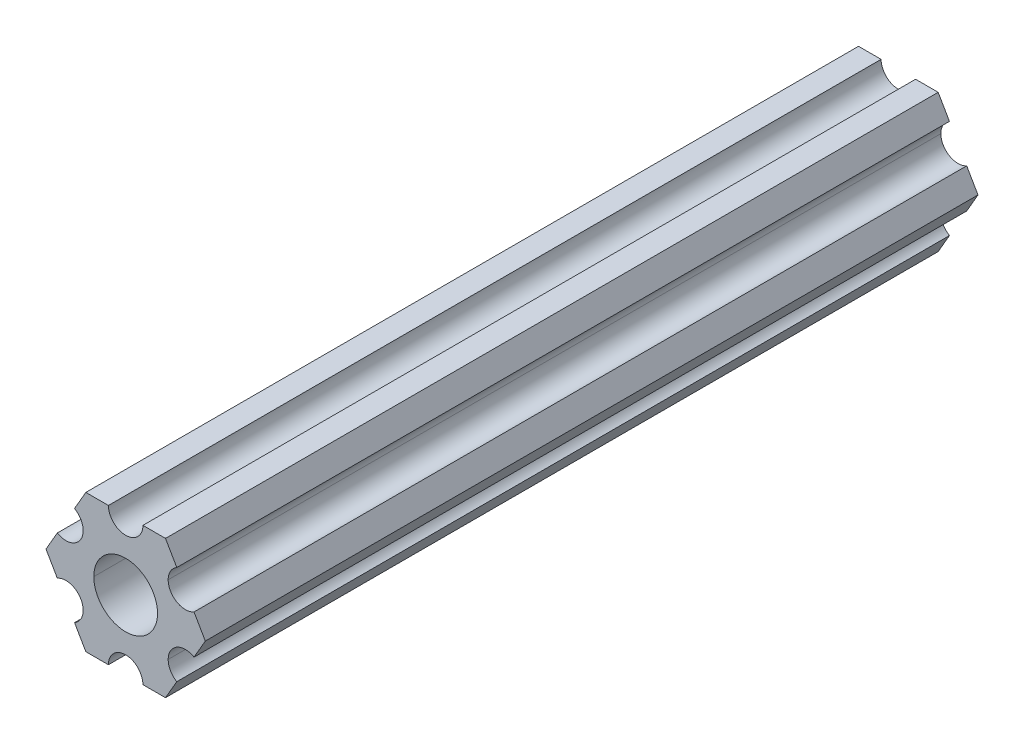
ISO-10303-21;
HEADER;
FILE_DESCRIPTION(('STEP AP214'),'2;1');
FILE_NAME('part.step','',(''),(''),'','','');
FILE_SCHEMA(('AUTOMOTIVE_DESIGN { 1 0 10303 214 1 1 1 1 }'));
ENDSEC;
DATA;
#1=APPLICATION_CONTEXT('core data for automotive mechanical design processes');
#2=APPLICATION_PROTOCOL_DEFINITION('international standard','automotive_design',2000,#1);
#3=PRODUCT_CONTEXT('',#1,'mechanical');
#4=PRODUCT('Part','Part','',(#3));
#5=PRODUCT_RELATED_PRODUCT_CATEGORY('part','',(#4));
#6=PRODUCT_DEFINITION_FORMATION('','',#4);
#7=PRODUCT_DEFINITION_CONTEXT('part definition',#1,'design');
#8=PRODUCT_DEFINITION('design','',#6,#7);
#9=PRODUCT_DEFINITION_SHAPE('','',#8);
#10=(LENGTH_UNIT() NAMED_UNIT(*) SI_UNIT(.MILLI.,.METRE.));
#11=(NAMED_UNIT(*) PLANE_ANGLE_UNIT() SI_UNIT($,.RADIAN.));
#12=(NAMED_UNIT(*) SI_UNIT($,.STERADIAN.) SOLID_ANGLE_UNIT());
#13=UNCERTAINTY_MEASURE_WITH_UNIT(LENGTH_MEASURE(1.E-05),#10,'distance_accuracy_value','');
#14=(GEOMETRIC_REPRESENTATION_CONTEXT(3) GLOBAL_UNCERTAINTY_ASSIGNED_CONTEXT((#13)) GLOBAL_UNIT_ASSIGNED_CONTEXT((#10,
#11,#12)) REPRESENTATION_CONTEXT('',''));
#15=CARTESIAN_POINT('',(0.,0.,0.));
#16=DIRECTION('',(0.,0.,1.));
#17=DIRECTION('',(1.,0.,0.));
#18=AXIS2_PLACEMENT_3D('',#15,#16,#17);
#19=CARTESIAN_POINT('',(6.29301142309098,-1.80018429024546,85.725));
#20=DIRECTION('',(-0.866025434075723,0.499999947533953,0.));
#21=DIRECTION('',(0.,0.,1.));
#22=AXIS2_PLACEMENT_3D('',#19,#20,#21);
#23=PLANE('',#22);
#24=DIRECTION('',(0.499999947533953,0.866025434075723,0.));
#25=VECTOR('',#24,1.);
#26=CARTESIAN_POINT('',(6.29301142309098,-1.80018429024546,71.12));
#27=LINE('',#26,#25);
#28=CARTESIAN_POINT('',(6.29301142309098,-1.80018429024546,71.12));
#29=VERTEX_POINT('',#28);
#30=CARTESIAN_POINT('',(7.33234841870826,4.44212519415746E-07,71.12));
#31=VERTEX_POINT('',#30);
#32=EDGE_CURVE('E398',#29,#31,#27,.T.);
#33=ORIENTED_EDGE('',*,*,#32,.F.);
#34=DIRECTION('',(0.,0.,-1.));
#35=VECTOR('',#34,1.);
#36=CARTESIAN_POINT('',(6.29301142309098,-1.80018429024546,85.725));
#37=LINE('',#36,#35);
#38=CARTESIAN_POINT('',(6.29301142309098,-1.80018429024546,0.));
#39=VERTEX_POINT('',#38);
#40=EDGE_CURVE('E270',#29,#39,#37,.T.);
#41=ORIENTED_EDGE('',*,*,#40,.T.);
#42=DIRECTION('',(0.499999947533953,0.866025434075723,0.));
#43=VECTOR('',#42,1.);
#44=CARTESIAN_POINT('',(6.29301142309098,-1.80018429024546,0.));
#45=LINE('',#44,#43);
#46=CARTESIAN_POINT('',(7.33234841870826,4.44212518961143E-07,0.));
#47=VERTEX_POINT('',#46);
#48=EDGE_CURVE('E292',#39,#47,#45,.T.);
#49=ORIENTED_EDGE('',*,*,#48,.T.);
#50=DIRECTION('',(0.,0.,1.));
#51=VECTOR('',#50,1.);
#52=CARTESIAN_POINT('',(7.33234841870827,4.44212519169686E-07,85.725));
#53=LINE('',#52,#51);
#54=EDGE_CURVE('E65',#47,#31,#53,.T.);
#55=ORIENTED_EDGE('',*,*,#54,.T.);
#56=EDGE_LOOP('',(#33,#41,#49,#55));
#57=FACE_BOUND('',#56,.T.);
#58=ADVANCED_FACE('F57',(#57),#23,.F.);
#59=CARTESIAN_POINT('',(7.33234841870827,4.44212519169686E-07,85.725));
#60=DIRECTION('',(-0.866025373493145,-0.500000052466057,0.));
#61=DIRECTION('',(-0.500000052466057,0.866025373493145,0.));
#62=AXIS2_PLACEMENT_3D('',#59,#60,#61);
#63=PLANE('',#62);
#64=DIRECTION('',(-0.500000052466057,0.866025373493145,0.));
#65=VECTOR('',#64,1.);
#66=CARTESIAN_POINT('',(7.33234841870827,4.44212519169686E-07,71.12));
#67=LINE('',#66,#65);
#68=CARTESIAN_POINT('',(6.29301120497139,1.80018505273895,71.12));
#69=VERTEX_POINT('',#68);
#70=EDGE_CURVE('E406',#31,#69,#67,.T.);
#71=ORIENTED_EDGE('',*,*,#70,.F.);
#72=ORIENTED_EDGE('',*,*,#54,.F.);
#73=DIRECTION('',(-0.500000052466057,0.866025373493145,0.));
#74=VECTOR('',#73,1.);
#75=CARTESIAN_POINT('',(7.33234841870827,4.44212519198906E-07,0.));
#76=LINE('',#75,#74);
#77=CARTESIAN_POINT('',(6.29301120497139,1.80018505273894,0.));
#78=VERTEX_POINT('',#77);
#79=EDGE_CURVE('E288',#47,#78,#76,.T.);
#80=ORIENTED_EDGE('',*,*,#79,.T.);
#81=DIRECTION('',(0.,0.,1.));
#82=VECTOR('',#81,1.);
#83=CARTESIAN_POINT('',(6.29301120497139,1.80018505273894,85.725));
#84=LINE('',#83,#82);
#85=EDGE_CURVE('E390',#78,#69,#84,.T.);
#86=ORIENTED_EDGE('',*,*,#85,.T.);
#87=EDGE_LOOP('',(#71,#72,#80,#86));
#88=FACE_BOUND('',#87,.T.);
#89=ADVANCED_FACE('F404',(#88),#63,.F.);
#90=CARTESIAN_POINT('',(5.49926112168156,3.17500033315934,85.725));
#91=DIRECTION('',(0.,0.,-1.));
#92=DIRECTION('',(-1.,0.,0.));
#93=AXIS2_PLACEMENT_3D('',#90,#91,#92);
#94=CYLINDRICAL_SURFACE('',#93,1.5875);
#95=CARTESIAN_POINT('',(5.49926112168156,3.17500033315934,71.12));
#96=DIRECTION('',(0.,0.,1.));
#97=DIRECTION('',(1.,0.,0.));
#98=AXIS2_PLACEMENT_3D('',#95,#96,#97);
#99=CIRCLE('',#98,1.5875);
#100=CARTESIAN_POINT('',(3.91176112168156,3.17500033315934,71.12));
#101=VERTEX_POINT('',#100);
#102=EDGE_CURVE('E409',#69,#101,#99,.F.);
#103=ORIENTED_EDGE('',*,*,#102,.F.);
#104=ORIENTED_EDGE('',*,*,#85,.F.);
#105=CARTESIAN_POINT('',(5.49926112168156,3.17500033315934,0.));
#106=DIRECTION('',(0.,0.,-1.));
#107=DIRECTION('',(-1.,0.,0.));
#108=AXIS2_PLACEMENT_3D('',#105,#106,#107);
#109=CIRCLE('',#108,1.5875);
#110=CARTESIAN_POINT('',(3.91176112168156,3.17500033315934,0.));
#111=VERTEX_POINT('',#110);
#112=EDGE_CURVE('E262',#78,#111,#109,.T.);
#113=ORIENTED_EDGE('',*,*,#112,.T.);
#114=DIRECTION('',(0.,0.,-1.));
#115=VECTOR('',#114,1.);
#116=CARTESIAN_POINT('',(3.91176112168156,3.17500033315934,85.725));
#117=LINE('',#116,#115);
#118=EDGE_CURVE('E273',#101,#111,#117,.T.);
#119=ORIENTED_EDGE('',*,*,#118,.F.);
#120=EDGE_LOOP('',(#103,#104,#113,#119));
#121=FACE_BOUND('',#120,.T.);
#122=ADVANCED_FACE('F869',(#121),#94,.F.);
#123=CARTESIAN_POINT('',(4.70551103839172,4.54981561357972,85.725));
#124=DIRECTION('',(-0.866025373493151,-0.500000052466046,0.));
#125=DIRECTION('',(-0.500000052466046,0.866025373493151,0.));
#126=AXIS2_PLACEMENT_3D('',#123,#124,#125);
#127=PLANE('',#126);
#128=DIRECTION('',(-0.500000052466046,0.866025373493151,0.));
#129=VECTOR('',#128,1.);
#130=CARTESIAN_POINT('',(4.70551103839172,4.54981561357972,71.12));
#131=LINE('',#130,#129);
#132=CARTESIAN_POINT('',(4.70551103839172,4.54981561357972,71.12));
#133=VERTEX_POINT('',#132);
#134=CARTESIAN_POINT('',(3.66617382465481,6.35000022210627,71.12));
#135=VERTEX_POINT('',#134);
#136=EDGE_CURVE('E479',#133,#135,#131,.T.);
#137=ORIENTED_EDGE('',*,*,#136,.F.);
#138=DIRECTION('',(0.,0.,1.));
#139=VECTOR('',#138,1.);
#140=CARTESIAN_POINT('',(4.70551103839172,4.54981561357972,85.725));
#141=LINE('',#140,#139);
#142=CARTESIAN_POINT('',(4.70551103839172,4.54981561357972,0.));
#143=VERTEX_POINT('',#142);
#144=EDGE_CURVE('E281',#143,#133,#141,.T.);
#145=ORIENTED_EDGE('',*,*,#144,.F.);
#146=DIRECTION('',(-0.500000052466046,0.866025373493151,0.));
#147=VECTOR('',#146,1.);
#148=CARTESIAN_POINT('',(4.70551103839172,4.54981561357972,0.));
#149=LINE('',#148,#147);
#150=CARTESIAN_POINT('',(3.66617382465481,6.35000022210627,0.));
#151=VERTEX_POINT('',#150);
#152=EDGE_CURVE('E259',#143,#151,#149,.T.);
#153=ORIENTED_EDGE('',*,*,#152,.T.);
#154=DIRECTION('',(0.,0.,1.));
#155=VECTOR('',#154,1.);
#156=CARTESIAN_POINT('',(3.66617382465481,6.35000022210627,85.725));
#157=LINE('',#156,#155);
#158=EDGE_CURVE('E386',#151,#135,#157,.T.);
#159=ORIENTED_EDGE('',*,*,#158,.T.);
#160=EDGE_LOOP('',(#137,#145,#153,#159));
#161=FACE_BOUND('',#160,.T.);
#162=ADVANCED_FACE('F491',(#161),#127,.F.);
#163=CARTESIAN_POINT('',(3.66617382465481,6.35000022210627,85.725));
#164=DIRECTION('',(6.05825850611185E-08,-1.,0.));
#165=DIRECTION('',(0.,0.,-1.));
#166=AXIS2_PLACEMENT_3D('',#163,#164,#165);
#167=PLANE('',#166);
#168=DIRECTION('',(-0.999999999999998,-6.05825850611184E-08,0.));
#169=VECTOR('',#168,1.);
#170=CARTESIAN_POINT('',(3.66617382465481,6.35000022210627,71.12));
#171=LINE('',#170,#169);
#172=CARTESIAN_POINT('',(1.58749961530074,6.35,71.12));
#173=VERTEX_POINT('',#172);
#174=EDGE_CURVE('E476',#135,#173,#171,.T.);
#175=ORIENTED_EDGE('',*,*,#174,.F.);
#176=ORIENTED_EDGE('',*,*,#158,.F.);
#177=DIRECTION('',(-1.,0.,0.));
#178=VECTOR('',#177,1.);
#179=CARTESIAN_POINT('',(5.49926112168156,6.35000022210627,0.));
#180=LINE('',#179,#178);
#181=CARTESIAN_POINT('',(1.58749961530073,6.35000015914054,0.));
#182=VERTEX_POINT('',#181);
#183=EDGE_CURVE('E263',#151,#182,#180,.T.);
#184=ORIENTED_EDGE('',*,*,#183,.T.);
#185=DIRECTION('',(0.,0.,1.));
#186=VECTOR('',#185,1.);
#187=CARTESIAN_POINT('',(1.58749961530074,6.35000009617482,85.725));
#188=LINE('',#187,#186);
#189=EDGE_CURVE('E303',#182,#173,#188,.T.);
#190=ORIENTED_EDGE('',*,*,#189,.T.);
#191=EDGE_LOOP('',(#175,#176,#184,#190));
#192=FACE_BOUND('',#191,.T.);
#193=ADVANCED_FACE('F498',(#192),#167,.F.);
#194=CARTESIAN_POINT('',(-3.84699260060323E-07,6.35,85.725));
#195=DIRECTION('',(0.,0.,-1.));
#196=DIRECTION('',(-1.,0.,0.));
#197=AXIS2_PLACEMENT_3D('',#194,#195,#196);
#198=CYLINDRICAL_SURFACE('',#197,1.5875);
#199=CARTESIAN_POINT('',(-3.84699260060323E-07,6.35,71.12));
#200=DIRECTION('',(0.,0.,1.));
#201=DIRECTION('',(1.,0.,0.));
#202=AXIS2_PLACEMENT_3D('',#199,#200,#201);
#203=CIRCLE('',#202,1.5875);
#204=CARTESIAN_POINT('',(-1.58750038469926,6.34999990382518,71.12));
#205=VERTEX_POINT('',#204);
#206=EDGE_CURVE('E473',#173,#205,#203,.F.);
#207=ORIENTED_EDGE('',*,*,#206,.F.);
#208=ORIENTED_EDGE('',*,*,#189,.F.);
#209=CARTESIAN_POINT('',(-3.84699260060323E-07,6.35,0.));
#210=DIRECTION('',(0.,0.,-1.));
#211=DIRECTION('',(-1.,0.,0.));
#212=AXIS2_PLACEMENT_3D('',#209,#210,#211);
#213=CIRCLE('',#212,1.5875);
#214=CARTESIAN_POINT('',(-1.58750038469926,6.34999990382519,0.));
#215=VERTEX_POINT('',#214);
#216=EDGE_CURVE('E329',#182,#215,#213,.T.);
#217=ORIENTED_EDGE('',*,*,#216,.T.);
#218=DIRECTION('',(0.,0.,1.));
#219=VECTOR('',#218,1.);
#220=CARTESIAN_POINT('',(-1.58750038469926,6.34999990382518,85.725));
#221=LINE('',#220,#219);
#222=EDGE_CURVE('E299',#215,#205,#221,.T.);
#223=ORIENTED_EDGE('',*,*,#222,.T.);
#224=EDGE_LOOP('',(#207,#208,#217,#223));
#225=FACE_BOUND('',#224,.T.);
#226=ADVANCED_FACE('F502',(#225),#198,.F.);
#227=CARTESIAN_POINT('',(-1.58750038469926,6.34999990382518,85.725));
#228=DIRECTION('',(6.05825963273174E-08,-1.,0.));
#229=DIRECTION('',(0.,0.,-1.));
#230=AXIS2_PLACEMENT_3D('',#227,#228,#229);
#231=PLANE('',#230);
#232=DIRECTION('',(-0.999999999999998,-6.05825963273173E-08,0.));
#233=VECTOR('',#232,1.);
#234=CARTESIAN_POINT('',(-1.58750038469926,6.34999990382518,71.12));
#235=LINE('',#234,#233);
#236=CARTESIAN_POINT('',(-3.66617454558244,6.34999986184803,71.12));
#237=VERTEX_POINT('',#236);
#238=EDGE_CURVE('E470',#205,#237,#235,.T.);
#239=ORIENTED_EDGE('',*,*,#238,.F.);
#240=ORIENTED_EDGE('',*,*,#222,.F.);
#241=DIRECTION('',(-1.,0.,0.));
#242=VECTOR('',#241,1.);
#243=CARTESIAN_POINT('',(5.49926112168156,6.34999990382519,0.));
#244=LINE('',#243,#242);
#245=CARTESIAN_POINT('',(-3.66617454558244,6.34999986184803,0.));
#246=VERTEX_POINT('',#245);
#247=EDGE_CURVE('E333',#215,#246,#244,.T.);
#248=ORIENTED_EDGE('',*,*,#247,.T.);
#249=DIRECTION('',(0.,0.,1.));
#250=VECTOR('',#249,1.);
#251=CARTESIAN_POINT('',(-3.66617459405349,6.3499997778937,85.725));
#252=LINE('',#251,#250);
#253=EDGE_CURVE('E286',#246,#237,#252,.T.);
#254=ORIENTED_EDGE('',*,*,#253,.T.);
#255=EDGE_LOOP('',(#239,#240,#248,#254));
#256=FACE_BOUND('',#255,.T.);
#257=ADVANCED_FACE('F504',(#256),#231,.F.);
#258=CARTESIAN_POINT('',(-3.66617459405349,6.3499997778937,85.725));
#259=DIRECTION('',(0.866025434075729,-0.499999947533942,0.));
#260=DIRECTION('',(0.,0.,-1.));
#261=AXIS2_PLACEMENT_3D('',#258,#259,#260);
#262=PLANE('',#261);
#263=DIRECTION('',(-0.499999947533942,-0.866025434075729,0.));
#264=VECTOR('',#263,1.);
#265=CARTESIAN_POINT('',(-3.66617459405349,6.3499997778937,71.12));
#266=LINE('',#265,#264);
#267=CARTESIAN_POINT('',(-4.70551158967065,4.54981504343587,71.12));
#268=VERTEX_POINT('',#267);
#269=EDGE_CURVE('E467',#237,#268,#266,.T.);
#270=ORIENTED_EDGE('',*,*,#269,.F.);
#271=ORIENTED_EDGE('',*,*,#253,.F.);
#272=DIRECTION('',(-0.499999947533943,-0.866025434075729,0.));
#273=VECTOR('',#272,1.);
#274=CARTESIAN_POINT('',(-3.66617459405349,6.3499997778937,0.));
#275=LINE('',#274,#273);
#276=CARTESIAN_POINT('',(-4.70551158967065,4.54981504343587,0.));
#277=VERTEX_POINT('',#276);
#278=EDGE_CURVE('E345',#246,#277,#275,.T.);
#279=ORIENTED_EDGE('',*,*,#278,.T.);
#280=DIRECTION('',(0.,0.,1.));
#281=VECTOR('',#280,1.);
#282=CARTESIAN_POINT('',(-4.70551158967065,4.54981504343587,85.725));
#283=LINE('',#282,#281);
#284=EDGE_CURVE('E282',#277,#268,#283,.T.);
#285=ORIENTED_EDGE('',*,*,#284,.T.);
#286=EDGE_LOOP('',(#270,#271,#279,#285));
#287=FACE_BOUND('',#286,.T.);
#288=ADVANCED_FACE('F509',(#287),#262,.F.);
#289=CARTESIAN_POINT('',(-5.49926150638082,3.17499966684067,85.725));
#290=DIRECTION('',(0.,0.,-1.));
#291=DIRECTION('',(-1.,0.,0.));
#292=AXIS2_PLACEMENT_3D('',#289,#290,#291);
#293=CYLINDRICAL_SURFACE('',#292,1.5875);
#294=CARTESIAN_POINT('',(-5.49926150638082,3.17499966684067,71.12));
#295=DIRECTION('',(0.,0.,1.));
#296=DIRECTION('',(1.,0.,0.));
#297=AXIS2_PLACEMENT_3D('',#294,#295,#296);
#298=CIRCLE('',#297,1.5875);
#299=CARTESIAN_POINT('',(-6.29301142309098,1.80018429024547,71.12));
#300=VERTEX_POINT('',#299);
#301=EDGE_CURVE('E464',#268,#300,#298,.F.);
#302=ORIENTED_EDGE('',*,*,#301,.F.);
#303=ORIENTED_EDGE('',*,*,#284,.F.);
#304=CARTESIAN_POINT('',(-5.49926150638082,3.17499966684067,0.));
#305=DIRECTION('',(0.,0.,-1.));
#306=DIRECTION('',(-1.,0.,0.));
#307=AXIS2_PLACEMENT_3D('',#304,#305,#306);
#308=CIRCLE('',#307,1.5875);
#309=CARTESIAN_POINT('',(-6.29301142309098,1.80018429024547,0.));
#310=VERTEX_POINT('',#309);
#311=EDGE_CURVE('E341',#277,#310,#308,.T.);
#312=ORIENTED_EDGE('',*,*,#311,.T.);
#313=DIRECTION('',(0.,0.,1.));
#314=VECTOR('',#313,1.);
#315=CARTESIAN_POINT('',(-6.29301142309098,1.80018429024547,85.725));
#316=LINE('',#315,#314);
#317=EDGE_CURVE('E287',#310,#300,#316,.T.);
#318=ORIENTED_EDGE('',*,*,#317,.T.);
#319=EDGE_LOOP('',(#302,#303,#312,#318));
#320=FACE_BOUND('',#319,.T.);
#321=ADVANCED_FACE('F512',(#320),#293,.F.);
#322=CARTESIAN_POINT('',(-6.29301142309098,1.80018429024547,85.725));
#323=DIRECTION('',(0.866025434075724,-0.499999947533952,0.));
#324=DIRECTION('',(0.,0.,-1.));
#325=AXIS2_PLACEMENT_3D('',#322,#323,#324);
#326=PLANE('',#325);
#327=DIRECTION('',(-0.499999947533952,-0.866025434075724,0.));
#328=VECTOR('',#327,1.);
#329=CARTESIAN_POINT('',(-6.29301142309098,1.80018429024547,71.12));
#330=LINE('',#329,#328);
#331=CARTESIAN_POINT('',(-7.33234841870827,-4.44212524036369E-07,71.12));
#332=VERTEX_POINT('',#331);
#333=EDGE_CURVE('E461',#300,#332,#330,.T.);
#334=ORIENTED_EDGE('',*,*,#333,.F.);
#335=ORIENTED_EDGE('',*,*,#317,.F.);
#336=DIRECTION('',(-0.499999947533952,-0.866025434075724,0.));
#337=VECTOR('',#336,1.);
#338=CARTESIAN_POINT('',(-6.29301142309098,1.80018429024547,0.));
#339=LINE('',#338,#337);
#340=CARTESIAN_POINT('',(-7.33234841870826,-4.44212524036367E-07,0.));
#341=VERTEX_POINT('',#340);
#342=EDGE_CURVE('E337',#310,#341,#339,.T.);
#343=ORIENTED_EDGE('',*,*,#342,.T.);
#344=DIRECTION('',(0.,0.,1.));
#345=VECTOR('',#344,1.);
#346=CARTESIAN_POINT('',(-7.33234841870827,-4.44212523790841E-07,85.725));
#347=LINE('',#346,#345);
#348=EDGE_CURVE('E269',#341,#332,#347,.T.);
#349=ORIENTED_EDGE('',*,*,#348,.T.);
#350=EDGE_LOOP('',(#334,#335,#343,#349));
#351=FACE_BOUND('',#350,.T.);
#352=ADVANCED_FACE('F517',(#351),#326,.F.);
#353=CARTESIAN_POINT('',(-7.33234841870827,-4.44212523790841E-07,85.725));
#354=DIRECTION('',(0.866025373493151,0.500000052466045,0.));
#355=DIRECTION('',(0.,0.,-1.));
#356=AXIS2_PLACEMENT_3D('',#353,#354,#355);
#357=PLANE('',#356);
#358=DIRECTION('',(0.500000052466045,-0.866025373493151,0.));
#359=VECTOR('',#358,1.);
#360=CARTESIAN_POINT('',(-7.33234841870827,-4.44212523790841E-07,71.12));
#361=LINE('',#360,#359);
#362=CARTESIAN_POINT('',(-6.29301120497141,-1.80018505273896,71.12));
#363=VERTEX_POINT('',#362);
#364=EDGE_CURVE('E458',#332,#363,#361,.T.);
#365=ORIENTED_EDGE('',*,*,#364,.F.);
#366=ORIENTED_EDGE('',*,*,#348,.F.);
#367=DIRECTION('',(0.500000052466045,-0.866025373493151,0.));
#368=VECTOR('',#367,1.);
#369=CARTESIAN_POINT('',(-7.33234841870827,-4.44212523969395E-07,0.));
#370=LINE('',#369,#368);
#371=CARTESIAN_POINT('',(-6.29301120497141,-1.80018505273897,0.));
#372=VERTEX_POINT('',#371);
#373=EDGE_CURVE('E308',#341,#372,#370,.T.);
#374=ORIENTED_EDGE('',*,*,#373,.T.);
#375=DIRECTION('',(0.,0.,1.));
#376=VECTOR('',#375,1.);
#377=CARTESIAN_POINT('',(-6.29301120497141,-1.80018505273897,85.725));
#378=LINE('',#377,#376);
#379=EDGE_CURVE('E265',#372,#363,#378,.T.);
#380=ORIENTED_EDGE('',*,*,#379,.T.);
#381=EDGE_LOOP('',(#365,#366,#374,#380));
#382=FACE_BOUND('',#381,.T.);
#383=ADVANCED_FACE('F520',(#382),#357,.F.);
#384=CARTESIAN_POINT('',(-5.49926112168156,-3.17500033315934,85.725));
#385=DIRECTION('',(0.,0.,-1.));
#386=DIRECTION('',(-1.,0.,0.));
#387=AXIS2_PLACEMENT_3D('',#384,#385,#386);
#388=CYLINDRICAL_SURFACE('',#387,1.5875);
#389=CARTESIAN_POINT('',(-5.49926112168156,-3.17500033315934,71.12));
#390=DIRECTION('',(0.,0.,1.));
#391=DIRECTION('',(1.,0.,0.));
#392=AXIS2_PLACEMENT_3D('',#389,#390,#391);
#393=CIRCLE('',#392,1.5875);
#394=CARTESIAN_POINT('',(-4.70551103839172,-4.54981561357972,71.12));
#395=VERTEX_POINT('',#394);
#396=EDGE_CURVE('E455',#363,#395,#393,.F.);
#397=ORIENTED_EDGE('',*,*,#396,.F.);
#398=ORIENTED_EDGE('',*,*,#379,.F.);
#399=CARTESIAN_POINT('',(-5.49926112168156,-3.17500033315934,0.));
#400=DIRECTION('',(0.,0.,-1.));
#401=DIRECTION('',(-1.,0.,0.));
#402=AXIS2_PLACEMENT_3D('',#399,#400,#401);
#403=CIRCLE('',#402,1.5875);
#404=CARTESIAN_POINT('',(-4.70551103839172,-4.54981561357972,0.));
#405=VERTEX_POINT('',#404);
#406=EDGE_CURVE('E304',#372,#405,#403,.T.);
#407=ORIENTED_EDGE('',*,*,#406,.T.);
#408=DIRECTION('',(0.,0.,1.));
#409=VECTOR('',#408,1.);
#410=CARTESIAN_POINT('',(-4.70551103839172,-4.54981561357972,85.725));
#411=LINE('',#410,#409);
#412=EDGE_CURVE('E252',#405,#395,#411,.T.);
#413=ORIENTED_EDGE('',*,*,#412,.T.);
#414=EDGE_LOOP('',(#397,#398,#407,#413));
#415=FACE_BOUND('',#414,.T.);
#416=ADVANCED_FACE('F526',(#415),#388,.F.);
#417=CARTESIAN_POINT('',(-4.70551103839172,-4.54981561357972,85.725));
#418=DIRECTION('',(0.866025373493152,0.500000052466045,0.));
#419=DIRECTION('',(0.,0.,-1.));
#420=AXIS2_PLACEMENT_3D('',#417,#418,#419);
#421=PLANE('',#420);
#422=DIRECTION('',(0.500000052466045,-0.866025373493152,0.));
#423=VECTOR('',#422,1.);
#424=CARTESIAN_POINT('',(-4.70551103839172,-4.54981561357972,71.12));
#425=LINE('',#424,#423);
#426=CARTESIAN_POINT('',(-3.66617382465481,-6.35000022210628,71.12));
#427=VERTEX_POINT('',#426);
#428=EDGE_CURVE('E452',#395,#427,#425,.T.);
#429=ORIENTED_EDGE('',*,*,#428,.F.);
#430=ORIENTED_EDGE('',*,*,#412,.F.);
#431=DIRECTION('',(0.500000052466045,-0.866025373493151,0.));
#432=VECTOR('',#431,1.);
#433=CARTESIAN_POINT('',(-4.70551103839172,-4.54981561357972,0.));
#434=LINE('',#433,#432);
#435=CARTESIAN_POINT('',(-3.66617382465481,-6.35000022210628,0.));
#436=VERTEX_POINT('',#435);
#437=EDGE_CURVE('E309',#405,#436,#434,.T.);
#438=ORIENTED_EDGE('',*,*,#437,.T.);
#439=DIRECTION('',(0.,0.,1.));
#440=VECTOR('',#439,1.);
#441=CARTESIAN_POINT('',(-3.66617382465481,-6.35000022210628,85.725));
#442=LINE('',#441,#440);
#443=EDGE_CURVE('E370',#436,#427,#442,.T.);
#444=ORIENTED_EDGE('',*,*,#443,.T.);
#445=EDGE_LOOP('',(#429,#430,#438,#444));
#446=FACE_BOUND('',#445,.T.);
#447=ADVANCED_FACE('F807',(#446),#421,.F.);
#448=CARTESIAN_POINT('',(-3.66617382465481,-6.35000022210628,85.725));
#449=DIRECTION('',(-6.05825854783851E-08,1.,0.));
#450=DIRECTION('',(0.,0.,1.));
#451=AXIS2_PLACEMENT_3D('',#448,#449,#450);
#452=PLANE('',#451);
#453=DIRECTION('',(0.999999999999998,6.0582585478385E-08,0.));
#454=VECTOR('',#453,1.);
#455=CARTESIAN_POINT('',(-3.66617382465481,-6.35000022210628,71.12));
#456=LINE('',#455,#454);
#457=CARTESIAN_POINT('',(-1.58749961530073,-6.35000011105314,71.12));
#458=VERTEX_POINT('',#457);
#459=EDGE_CURVE('E449',#427,#458,#456,.T.);
#460=ORIENTED_EDGE('',*,*,#459,.F.);
#461=ORIENTED_EDGE('',*,*,#443,.F.);
#462=DIRECTION('',(1.,0.,0.));
#463=VECTOR('',#462,1.);
#464=CARTESIAN_POINT('',(5.49926112168156,-6.35000022210628,0.));
#465=LINE('',#464,#463);
#466=CARTESIAN_POINT('',(-1.58749961530073,-6.35000011105314,0.));
#467=VERTEX_POINT('',#466);
#468=EDGE_CURVE('E322',#436,#467,#465,.T.);
#469=ORIENTED_EDGE('',*,*,#468,.T.);
#470=DIRECTION('',(0.,0.,1.));
#471=VECTOR('',#470,1.);
#472=CARTESIAN_POINT('',(-1.58749961530074,-6.35,85.725));
#473=LINE('',#472,#471);
#474=EDGE_CURVE('E369',#467,#458,#473,.T.);
#475=ORIENTED_EDGE('',*,*,#474,.T.);
#476=EDGE_LOOP('',(#460,#461,#469,#475));
#477=FACE_BOUND('',#476,.T.);
#478=ADVANCED_FACE('F799',(#477),#452,.F.);
#479=CARTESIAN_POINT('',(3.8469926204343E-07,-6.35,85.725));
#480=DIRECTION('',(0.,0.,-1.));
#481=DIRECTION('',(-1.,0.,0.));
#482=AXIS2_PLACEMENT_3D('',#479,#480,#481);
#483=CYLINDRICAL_SURFACE('',#482,1.5875);
#484=CARTESIAN_POINT('',(3.8469926204343E-07,-6.35,71.12));
#485=DIRECTION('',(0.,0.,1.));
#486=DIRECTION('',(1.,0.,0.));
#487=AXIS2_PLACEMENT_3D('',#484,#485,#486);
#488=CIRCLE('',#487,1.5875);
#489=CARTESIAN_POINT('',(1.58750038469926,-6.34999990382518,71.12));
#490=VERTEX_POINT('',#489);
#491=EDGE_CURVE('E446',#458,#490,#488,.F.);
#492=ORIENTED_EDGE('',*,*,#491,.F.);
#493=ORIENTED_EDGE('',*,*,#474,.F.);
#494=CARTESIAN_POINT('',(3.8469926204343E-07,-6.35,0.));
#495=DIRECTION('',(0.,0.,-1.));
#496=DIRECTION('',(-1.,0.,0.));
#497=AXIS2_PLACEMENT_3D('',#494,#495,#496);
#498=CIRCLE('',#497,1.5875);
#499=CARTESIAN_POINT('',(1.58750038469926,-6.34999990382519,0.));
#500=VERTEX_POINT('',#499);
#501=EDGE_CURVE('E257',#467,#500,#498,.T.);
#502=ORIENTED_EDGE('',*,*,#501,.T.);
#503=DIRECTION('',(0.,0.,1.));
#504=VECTOR('',#503,1.);
#505=CARTESIAN_POINT('',(1.58750038469926,-6.34999990382518,85.725));
#506=LINE('',#505,#504);
#507=EDGE_CURVE('E314',#500,#490,#506,.T.);
#508=ORIENTED_EDGE('',*,*,#507,.T.);
#509=EDGE_LOOP('',(#492,#493,#502,#508));
#510=FACE_BOUND('',#509,.T.);
#511=ADVANCED_FACE('F791',(#510),#483,.F.);
#512=CARTESIAN_POINT('',(1.58750038469926,-6.34999990382518,85.725));
#513=DIRECTION('',(-6.05825721258438E-08,1.,0.));
#514=DIRECTION('',(0.,0.,1.));
#515=AXIS2_PLACEMENT_3D('',#512,#513,#514);
#516=PLANE('',#515);
#517=DIRECTION('',(0.999999999999998,6.05825721258437E-08,0.));
#518=VECTOR('',#517,1.);
#519=CARTESIAN_POINT('',(1.58750038469926,-6.34999990382518,71.12));
#520=LINE('',#519,#518);
#521=CARTESIAN_POINT('',(3.66617454558243,-6.34999986184804,71.12));
#522=VERTEX_POINT('',#521);
#523=EDGE_CURVE('E443',#490,#522,#520,.T.);
#524=ORIENTED_EDGE('',*,*,#523,.F.);
#525=ORIENTED_EDGE('',*,*,#507,.F.);
#526=DIRECTION('',(1.,0.,0.));
#527=VECTOR('',#526,1.);
#528=CARTESIAN_POINT('',(5.49926112168156,-6.34999990382519,0.));
#529=LINE('',#528,#527);
#530=CARTESIAN_POINT('',(3.66617454558244,-6.34999986184804,0.));
#531=VERTEX_POINT('',#530);
#532=EDGE_CURVE('E253',#500,#531,#529,.T.);
#533=ORIENTED_EDGE('',*,*,#532,.T.);
#534=DIRECTION('',(0.,0.,1.));
#535=VECTOR('',#534,1.);
#536=CARTESIAN_POINT('',(3.66617459405346,-6.34999977789375,85.725));
#537=LINE('',#536,#535);
#538=EDGE_CURVE('E310',#531,#522,#537,.T.);
#539=ORIENTED_EDGE('',*,*,#538,.T.);
#540=EDGE_LOOP('',(#524,#525,#533,#539));
#541=FACE_BOUND('',#540,.T.);
#542=ADVANCED_FACE('F783',(#541),#516,.F.);
#543=CARTESIAN_POINT('',(3.66617459405346,-6.34999977789375,85.725));
#544=DIRECTION('',(-0.86602543407573,0.499999947533941,0.));
#545=DIRECTION('',(0.,0.,1.));
#546=AXIS2_PLACEMENT_3D('',#543,#544,#545);
#547=PLANE('',#546);
#548=DIRECTION('',(0.499999947533941,0.86602543407573,0.));
#549=VECTOR('',#548,1.);
#550=CARTESIAN_POINT('',(3.66617459405346,-6.34999977789375,71.12));
#551=LINE('',#550,#549);
#552=CARTESIAN_POINT('',(4.70551158967065,-4.54981504343587,71.12));
#553=VERTEX_POINT('',#552);
#554=EDGE_CURVE('E438',#522,#553,#551,.T.);
#555=ORIENTED_EDGE('',*,*,#554,.F.);
#556=ORIENTED_EDGE('',*,*,#538,.F.);
#557=DIRECTION('',(0.49999994753394,0.86602543407573,0.));
#558=VECTOR('',#557,1.);
#559=CARTESIAN_POINT('',(3.66617459405346,-6.34999977789376,0.));
#560=LINE('',#559,#558);
#561=CARTESIAN_POINT('',(4.70551158967065,-4.54981504343587,0.));
#562=VERTEX_POINT('',#561);
#563=EDGE_CURVE('E258',#531,#562,#560,.T.);
#564=ORIENTED_EDGE('',*,*,#563,.T.);
#565=DIRECTION('',(0.,0.,-1.));
#566=VECTOR('',#565,1.);
#567=CARTESIAN_POINT('',(4.70551158967065,-4.54981504343587,85.725));
#568=LINE('',#567,#566);
#569=EDGE_CURVE('E315',#553,#562,#568,.T.);
#570=ORIENTED_EDGE('',*,*,#569,.F.);
#571=EDGE_LOOP('',(#555,#556,#564,#570));
#572=FACE_BOUND('',#571,.T.);
#573=ADVANCED_FACE('F777',(#572),#547,.F.);
#574=CARTESIAN_POINT('',(5.49926150638082,-3.17499966684067,85.725));
#575=DIRECTION('',(0.,0.,-1.));
#576=DIRECTION('',(-1.,0.,0.));
#577=AXIS2_PLACEMENT_3D('',#574,#575,#576);
#578=CYLINDRICAL_SURFACE('',#577,1.5875);
#579=CARTESIAN_POINT('',(5.49926150638082,-3.17499966684067,71.12));
#580=DIRECTION('',(0.,0.,1.));
#581=DIRECTION('',(1.,0.,0.));
#582=AXIS2_PLACEMENT_3D('',#579,#580,#581);
#583=CIRCLE('',#582,1.5875);
#584=CARTESIAN_POINT('',(3.91176150638082,-3.17499966684067,71.12));
#585=VERTEX_POINT('',#584);
#586=EDGE_CURVE('E72',#553,#585,#583,.F.);
#587=ORIENTED_EDGE('',*,*,#586,.F.);
#588=ORIENTED_EDGE('',*,*,#569,.T.);
#589=CARTESIAN_POINT('',(5.49926150638082,-3.17499966684067,0.));
#590=DIRECTION('',(0.,0.,-1.));
#591=DIRECTION('',(-1.,0.,0.));
#592=AXIS2_PLACEMENT_3D('',#589,#590,#591);
#593=CIRCLE('',#592,1.5875);
#594=CARTESIAN_POINT('',(3.91176150638082,-3.17499966684067,0.));
#595=VERTEX_POINT('',#594);
#596=EDGE_CURVE('E280',#562,#595,#593,.T.);
#597=ORIENTED_EDGE('',*,*,#596,.T.);
#598=DIRECTION('',(0.,0.,-1.));
#599=VECTOR('',#598,1.);
#600=CARTESIAN_POINT('',(3.91176150638082,-3.17499966684067,85.725));
#601=LINE('',#600,#599);
#602=EDGE_CURVE('E242',#585,#595,#601,.T.);
#603=ORIENTED_EDGE('',*,*,#602,.F.);
#604=EDGE_LOOP('',(#587,#588,#597,#603));
#605=FACE_BOUND('',#604,.T.);
#606=ADVANCED_FACE('F428',(#605),#578,.F.);
#607=CARTESIAN_POINT('',(0.,0.,85.725));
#608=DIRECTION('',(0.,0.,-1.));
#609=DIRECTION('',(-1.,0.,0.));
#610=AXIS2_PLACEMENT_3D('',#607,#608,#609);
#611=CYLINDRICAL_SURFACE('',#610,2.9337);
#612=CARTESIAN_POINT('',(0.,0.,71.12));
#613=DIRECTION('',(0.,0.,1.));
#614=DIRECTION('',(1.,0.,0.));
#615=AXIS2_PLACEMENT_3D('',#612,#613,#614);
#616=CIRCLE('',#615,2.9337);
#617=CARTESIAN_POINT('',(-2.9337,0.,71.12));
#618=VERTEX_POINT('',#617);
#619=CARTESIAN_POINT('',(2.9337,0.,71.12));
#620=VERTEX_POINT('',#619);
#621=EDGE_CURVE('E78',#618,#620,#616,.F.);
#622=ORIENTED_EDGE('',*,*,#621,.F.);
#623=DIRECTION('',(0.,0.,-1.));
#624=VECTOR('',#623,1.);
#625=CARTESIAN_POINT('',(-2.9337,0.,85.725));
#626=LINE('',#625,#624);
#627=CARTESIAN_POINT('',(-2.9337,0.,0.));
#628=VERTEX_POINT('',#627);
#629=EDGE_CURVE('E231',#618,#628,#626,.T.);
#630=ORIENTED_EDGE('',*,*,#629,.T.);
#631=CARTESIAN_POINT('',(0.,0.,0.));
#632=DIRECTION('',(0.,0.,1.));
#633=DIRECTION('',(-1.,0.,0.));
#634=AXIS2_PLACEMENT_3D('',#631,#632,#633);
#635=CIRCLE('',#634,2.9337);
#636=CARTESIAN_POINT('',(2.9337,0.,0.));
#637=VERTEX_POINT('',#636);
#638=EDGE_CURVE('E277',#637,#628,#635,.T.);
#639=ORIENTED_EDGE('',*,*,#638,.F.);
#640=DIRECTION('',(0.,0.,-1.));
#641=VECTOR('',#640,1.);
#642=CARTESIAN_POINT('',(2.9337,0.,85.725));
#643=LINE('',#642,#641);
#644=EDGE_CURVE('E233',#620,#637,#643,.T.);
#645=ORIENTED_EDGE('',*,*,#644,.F.);
#646=EDGE_LOOP('',(#622,#630,#639,#645));
#647=FACE_BOUND('',#646,.T.);
#648=ADVANCED_FACE('F229',(#647),#611,.F.);
#649=CARTESIAN_POINT('',(5.49926112168156,3.17500033315934,85.725));
#650=DIRECTION('',(0.,0.,-1.));
#651=DIRECTION('',(-1.,0.,0.));
#652=AXIS2_PLACEMENT_3D('',#649,#650,#651);
#653=CYLINDRICAL_SURFACE('',#652,1.5875);
#654=CARTESIAN_POINT('',(5.49926112168156,3.17500033315934,71.12));
#655=DIRECTION('',(0.,0.,1.));
#656=DIRECTION('',(1.,0.,0.));
#657=AXIS2_PLACEMENT_3D('',#654,#655,#656);
#658=CIRCLE('',#657,1.5875);
#659=EDGE_CURVE('E414',#101,#133,#658,.F.);
#660=ORIENTED_EDGE('',*,*,#659,.F.);
#661=ORIENTED_EDGE('',*,*,#118,.T.);
#662=CARTESIAN_POINT('',(5.49926112168156,3.17500033315934,0.));
#663=DIRECTION('',(0.,0.,-1.));
#664=DIRECTION('',(-1.,0.,0.));
#665=AXIS2_PLACEMENT_3D('',#662,#663,#664);
#666=CIRCLE('',#665,1.5875);
#667=EDGE_CURVE('E276',#111,#143,#666,.T.);
#668=ORIENTED_EDGE('',*,*,#667,.T.);
#669=ORIENTED_EDGE('',*,*,#144,.T.);
#670=EDGE_LOOP('',(#660,#661,#668,#669));
#671=FACE_BOUND('',#670,.T.);
#672=ADVANCED_FACE('F492',(#671),#653,.F.);
#673=CARTESIAN_POINT('',(5.49926150638082,-3.17499966684067,85.725));
#674=DIRECTION('',(0.,0.,-1.));
#675=DIRECTION('',(-1.,0.,0.));
#676=AXIS2_PLACEMENT_3D('',#673,#674,#675);
#677=CYLINDRICAL_SURFACE('',#676,1.5875);
#678=CARTESIAN_POINT('',(5.49926150638082,-3.17499966684067,71.12));
#679=DIRECTION('',(0.,0.,1.));
#680=DIRECTION('',(1.,0.,0.));
#681=AXIS2_PLACEMENT_3D('',#678,#679,#680);
#682=CIRCLE('',#681,1.5875);
#683=EDGE_CURVE('E235',#585,#29,#682,.F.);
#684=ORIENTED_EDGE('',*,*,#683,.F.);
#685=ORIENTED_EDGE('',*,*,#602,.T.);
#686=CARTESIAN_POINT('',(5.49926150638082,-3.17499966684067,0.));
#687=DIRECTION('',(0.,0.,-1.));
#688=DIRECTION('',(-1.,0.,0.));
#689=AXIS2_PLACEMENT_3D('',#686,#687,#688);
#690=CIRCLE('',#689,1.5875);
#691=EDGE_CURVE('E247',#595,#39,#690,.T.);
#692=ORIENTED_EDGE('',*,*,#691,.T.);
#693=ORIENTED_EDGE('',*,*,#40,.F.);
#694=EDGE_LOOP('',(#684,#685,#692,#693));
#695=FACE_BOUND('',#694,.T.);
#696=ADVANCED_FACE('F434',(#695),#677,.F.);
#697=CARTESIAN_POINT('',(0.,0.,85.725));
#698=DIRECTION('',(0.,0.,-1.));
#699=DIRECTION('',(-1.,0.,0.));
#700=AXIS2_PLACEMENT_3D('',#697,#698,#699);
#701=CYLINDRICAL_SURFACE('',#700,2.9337);
#702=CARTESIAN_POINT('',(0.,0.,71.12));
#703=DIRECTION('',(0.,0.,1.));
#704=DIRECTION('',(1.,0.,0.));
#705=AXIS2_PLACEMENT_3D('',#702,#703,#704);
#706=CIRCLE('',#705,2.9337);
#707=EDGE_CURVE('E12',#620,#618,#706,.F.);
#708=ORIENTED_EDGE('',*,*,#707,.F.);
#709=ORIENTED_EDGE('',*,*,#644,.T.);
#710=CARTESIAN_POINT('',(0.,0.,0.));
#711=DIRECTION('',(0.,0.,1.));
#712=DIRECTION('',(-1.,0.,0.));
#713=AXIS2_PLACEMENT_3D('',#710,#711,#712);
#714=CIRCLE('',#713,2.9337);
#715=EDGE_CURVE('E240',#628,#637,#714,.T.);
#716=ORIENTED_EDGE('',*,*,#715,.F.);
#717=ORIENTED_EDGE('',*,*,#629,.F.);
#718=EDGE_LOOP('',(#708,#709,#716,#717));
#719=FACE_BOUND('',#718,.T.);
#720=ADVANCED_FACE('F238',(#719),#701,.F.);
#721=CARTESIAN_POINT('',(5.49926112168156,3.17500033315934,0.));
#722=DIRECTION('',(0.,0.,1.));
#723=DIRECTION('',(1.,0.,0.));
#724=AXIS2_PLACEMENT_3D('',#721,#722,#723);
#725=PLANE('',#724);
#726=ORIENTED_EDGE('',*,*,#715,.T.);
#727=ORIENTED_EDGE('',*,*,#638,.T.);
#728=EDGE_LOOP('',(#726,#727));
#729=FACE_BOUND('',#728,.T.);
#730=ORIENTED_EDGE('',*,*,#596,.F.);
#731=ORIENTED_EDGE('',*,*,#563,.F.);
#732=ORIENTED_EDGE('',*,*,#532,.F.);
#733=ORIENTED_EDGE('',*,*,#501,.F.);
#734=ORIENTED_EDGE('',*,*,#468,.F.);
#735=ORIENTED_EDGE('',*,*,#437,.F.);
#736=ORIENTED_EDGE('',*,*,#406,.F.);
#737=ORIENTED_EDGE('',*,*,#373,.F.);
#738=ORIENTED_EDGE('',*,*,#342,.F.);
#739=ORIENTED_EDGE('',*,*,#311,.F.);
#740=ORIENTED_EDGE('',*,*,#278,.F.);
#741=ORIENTED_EDGE('',*,*,#247,.F.);
#742=ORIENTED_EDGE('',*,*,#216,.F.);
#743=ORIENTED_EDGE('',*,*,#183,.F.);
#744=ORIENTED_EDGE('',*,*,#152,.F.);
#745=ORIENTED_EDGE('',*,*,#667,.F.);
#746=ORIENTED_EDGE('',*,*,#112,.F.);
#747=ORIENTED_EDGE('',*,*,#79,.F.);
#748=ORIENTED_EDGE('',*,*,#48,.F.);
#749=ORIENTED_EDGE('',*,*,#691,.F.);
#750=EDGE_LOOP('',(#730,#731,#732,#733,#734,#735,#736,#737,#738,#739,#740,#741,#742,#743,#744,
#745,#746,#747,#748,#749));
#751=FACE_BOUND('',#750,.T.);
#752=ADVANCED_FACE('F432',(#729,#751),#725,.F.);
#753=CARTESIAN_POINT('',(5.49926112168156,3.17500033315934,71.12));
#754=DIRECTION('',(0.,0.,1.));
#755=DIRECTION('',(1.,0.,0.));
#756=AXIS2_PLACEMENT_3D('',#753,#754,#755);
#757=PLANE('',#756);
#758=ORIENTED_EDGE('',*,*,#621,.T.);
#759=ORIENTED_EDGE('',*,*,#707,.T.);
#760=EDGE_LOOP('',(#758,#759));
#761=FACE_BOUND('',#760,.T.);
#762=ORIENTED_EDGE('',*,*,#70,.T.);
#763=ORIENTED_EDGE('',*,*,#102,.T.);
#764=ORIENTED_EDGE('',*,*,#659,.T.);
#765=ORIENTED_EDGE('',*,*,#136,.T.);
#766=ORIENTED_EDGE('',*,*,#174,.T.);
#767=ORIENTED_EDGE('',*,*,#206,.T.);
#768=ORIENTED_EDGE('',*,*,#238,.T.);
#769=ORIENTED_EDGE('',*,*,#269,.T.);
#770=ORIENTED_EDGE('',*,*,#301,.T.);
#771=ORIENTED_EDGE('',*,*,#333,.T.);
#772=ORIENTED_EDGE('',*,*,#364,.T.);
#773=ORIENTED_EDGE('',*,*,#396,.T.);
#774=ORIENTED_EDGE('',*,*,#428,.T.);
#775=ORIENTED_EDGE('',*,*,#459,.T.);
#776=ORIENTED_EDGE('',*,*,#491,.T.);
#777=ORIENTED_EDGE('',*,*,#523,.T.);
#778=ORIENTED_EDGE('',*,*,#554,.T.);
#779=ORIENTED_EDGE('',*,*,#586,.T.);
#780=ORIENTED_EDGE('',*,*,#683,.T.);
#781=ORIENTED_EDGE('',*,*,#32,.T.);
#782=EDGE_LOOP('',(#762,#763,#764,#765,#766,#767,#768,#769,#770,#771,#772,#773,#774,#775,#776,
#777,#778,#779,#780,#781));
#783=FACE_BOUND('',#782,.T.);
#784=ADVANCED_FACE('F224',(#761,#783),#757,.T.);
#785=CLOSED_SHELL('',(#58,#89,#122,#162,#193,#226,#257,#288,#321,#352,#383,#416,#447,#478,#511,
#542,#573,#606,#648,#672,#696,#720,#752,#784));
#786=MANIFOLD_SOLID_BREP('B2',#785);
#787=ADVANCED_BREP_SHAPE_REPRESENTATION('',(#18,#786),#14);
#788=SHAPE_DEFINITION_REPRESENTATION(#9,#787);
ENDSEC;
END-ISO-10303-21;
